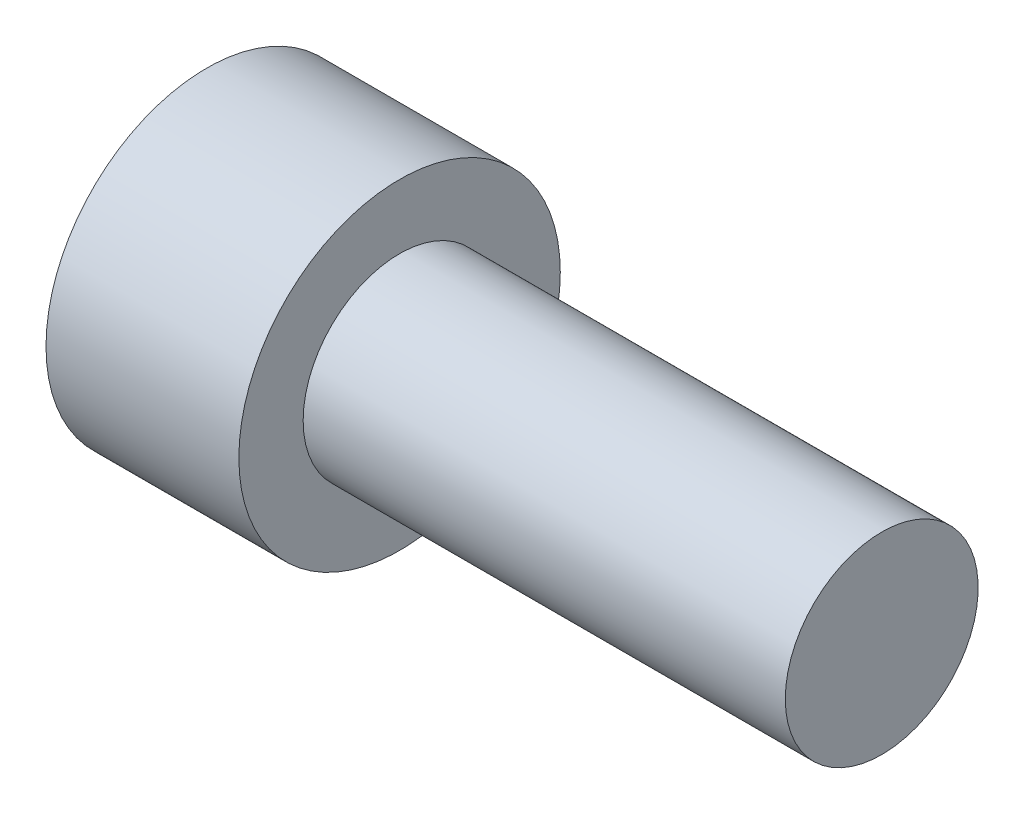
ISO-10303-21;
HEADER;
FILE_DESCRIPTION(('STEP AP214'),'2;1');
FILE_NAME('part.step','',(''),(''),'','','');
FILE_SCHEMA(('AUTOMOTIVE_DESIGN { 1 0 10303 214 1 1 1 1 }'));
ENDSEC;
DATA;
#1=APPLICATION_CONTEXT('core data for automotive mechanical design processes');
#2=APPLICATION_PROTOCOL_DEFINITION('international standard','automotive_design',2000,#1);
#3=PRODUCT_CONTEXT('',#1,'mechanical');
#4=PRODUCT('Part','Part','',(#3));
#5=PRODUCT_RELATED_PRODUCT_CATEGORY('part','',(#4));
#6=PRODUCT_DEFINITION_FORMATION('','',#4);
#7=PRODUCT_DEFINITION_CONTEXT('part definition',#1,'design');
#8=PRODUCT_DEFINITION('design','',#6,#7);
#9=PRODUCT_DEFINITION_SHAPE('','',#8);
#10=(LENGTH_UNIT() NAMED_UNIT(*) SI_UNIT(.MILLI.,.METRE.));
#11=(NAMED_UNIT(*) PLANE_ANGLE_UNIT() SI_UNIT($,.RADIAN.));
#12=(NAMED_UNIT(*) SI_UNIT($,.STERADIAN.) SOLID_ANGLE_UNIT());
#13=UNCERTAINTY_MEASURE_WITH_UNIT(LENGTH_MEASURE(1.E-05),#10,'distance_accuracy_value','');
#14=(GEOMETRIC_REPRESENTATION_CONTEXT(3) GLOBAL_UNCERTAINTY_ASSIGNED_CONTEXT((#13)) GLOBAL_UNIT_ASSIGNED_CONTEXT((#10,
#11,#12)) REPRESENTATION_CONTEXT('',''));
#15=CARTESIAN_POINT('',(0.,0.,0.));
#16=DIRECTION('',(0.,0.,1.));
#17=DIRECTION('',(1.,0.,0.));
#18=AXIS2_PLACEMENT_3D('',#15,#16,#17);
#19=CARTESIAN_POINT('',(0.,0.,0.));
#20=DIRECTION('',(1.,0.,0.));
#21=DIRECTION('',(0.,0.,-1.));
#22=AXIS2_PLACEMENT_3D('',#19,#20,#21);
#23=PLANE('',#22);
#24=CARTESIAN_POINT('',(0.,0.,0.));
#25=DIRECTION('',(-1.,0.,0.));
#26=DIRECTION('',(0.,0.,1.));
#27=AXIS2_PLACEMENT_3D('',#24,#25,#26);
#28=CIRCLE('',#27,5.);
#29=CARTESIAN_POINT('',(0.,0.,5.));
#30=VERTEX_POINT('',#29);
#31=EDGE_CURVE('E11',#30,#30,#28,.T.);
#32=ORIENTED_EDGE('',*,*,#31,.T.);
#33=EDGE_LOOP('',(#32));
#34=FACE_BOUND('',#33,.T.);
#35=DIRECTION('',(0.,0.5,0.866025403784438));
#36=VECTOR('',#35,1.);
#37=CARTESIAN_POINT('',(0.,-2.88675134594813,0.));
#38=LINE('',#37,#36);
#39=CARTESIAN_POINT('',(0.,-2.88675134594813,0.));
#40=VERTEX_POINT('',#39);
#41=CARTESIAN_POINT('',(0.,-1.44337567297406,2.5));
#42=VERTEX_POINT('',#41);
#43=EDGE_CURVE('E153',#40,#42,#38,.T.);
#44=ORIENTED_EDGE('',*,*,#43,.F.);
#45=DIRECTION('',(0.,-0.5,0.866025403784439));
#46=VECTOR('',#45,1.);
#47=CARTESIAN_POINT('',(0.,-1.44337567297407,-2.5));
#48=LINE('',#47,#46);
#49=CARTESIAN_POINT('',(0.,-1.44337567297407,-2.5));
#50=VERTEX_POINT('',#49);
#51=EDGE_CURVE('E53',#50,#40,#48,.T.);
#52=ORIENTED_EDGE('',*,*,#51,.F.);
#53=DIRECTION('',(0.,-1.,0.));
#54=VECTOR('',#53,1.);
#55=CARTESIAN_POINT('',(0.,1.44337567297406,-2.5));
#56=LINE('',#55,#54);
#57=CARTESIAN_POINT('',(0.,1.44337567297406,-2.5));
#58=VERTEX_POINT('',#57);
#59=EDGE_CURVE('E123',#58,#50,#56,.T.);
#60=ORIENTED_EDGE('',*,*,#59,.F.);
#61=DIRECTION('',(0.,-0.5,-0.866025403784438));
#62=VECTOR('',#61,1.);
#63=CARTESIAN_POINT('',(0.,2.88675134594813,0.));
#64=LINE('',#63,#62);
#65=CARTESIAN_POINT('',(0.,2.88675134594813,0.));
#66=VERTEX_POINT('',#65);
#67=EDGE_CURVE('E159',#66,#58,#64,.T.);
#68=ORIENTED_EDGE('',*,*,#67,.F.);
#69=DIRECTION('',(0.,0.5,-0.866025403784439));
#70=VECTOR('',#69,1.);
#71=CARTESIAN_POINT('',(0.,1.44337567297406,2.5));
#72=LINE('',#71,#70);
#73=CARTESIAN_POINT('',(0.,1.44337567297406,2.5));
#74=VERTEX_POINT('',#73);
#75=EDGE_CURVE('E157',#74,#66,#72,.T.);
#76=ORIENTED_EDGE('',*,*,#75,.F.);
#77=DIRECTION('',(0.,1.,0.));
#78=VECTOR('',#77,1.);
#79=CARTESIAN_POINT('',(0.,-1.44337567297406,2.5));
#80=LINE('',#79,#78);
#81=EDGE_CURVE('E155',#42,#74,#80,.T.);
#82=ORIENTED_EDGE('',*,*,#81,.F.);
#83=EDGE_LOOP('',(#44,#52,#60,#68,#76,#82));
#84=FACE_BOUND('',#83,.T.);
#85=ADVANCED_FACE('F39',(#34,#84),#23,.F.);
#86=CARTESIAN_POINT('',(0.,0.,0.));
#87=DIRECTION('',(-1.,0.,0.));
#88=DIRECTION('',(0.,0.,1.));
#89=AXIS2_PLACEMENT_3D('',#86,#87,#88);
#90=CYLINDRICAL_SURFACE('',#89,5.);
#91=ORIENTED_EDGE('',*,*,#31,.F.);
#92=EDGE_LOOP('',(#91));
#93=FACE_BOUND('',#92,.T.);
#94=CARTESIAN_POINT('',(6.,0.,0.));
#95=DIRECTION('',(-1.,0.,0.));
#96=DIRECTION('',(0.,0.,1.));
#97=AXIS2_PLACEMENT_3D('',#94,#95,#96);
#98=CIRCLE('',#97,5.);
#99=CARTESIAN_POINT('',(6.,0.,5.));
#100=VERTEX_POINT('',#99);
#101=EDGE_CURVE('E46',#100,#100,#98,.T.);
#102=ORIENTED_EDGE('',*,*,#101,.T.);
#103=EDGE_LOOP('',(#102));
#104=FACE_BOUND('',#103,.T.);
#105=ADVANCED_FACE('F187',(#93,#104),#90,.T.);
#106=CARTESIAN_POINT('',(6.,3.,0.));
#107=DIRECTION('',(-1.,0.,0.));
#108=DIRECTION('',(0.,0.,1.));
#109=AXIS2_PLACEMENT_3D('',#106,#107,#108);
#110=PLANE('',#109);
#111=ORIENTED_EDGE('',*,*,#101,.F.);
#112=EDGE_LOOP('',(#111));
#113=FACE_BOUND('',#112,.T.);
#114=CARTESIAN_POINT('',(6.,0.,0.));
#115=DIRECTION('',(-1.,0.,0.));
#116=DIRECTION('',(0.,0.,1.));
#117=AXIS2_PLACEMENT_3D('',#114,#115,#116);
#118=CIRCLE('',#117,3.);
#119=CARTESIAN_POINT('',(6.,0.,3.));
#120=VERTEX_POINT('',#119);
#121=EDGE_CURVE('E182',#120,#120,#118,.T.);
#122=ORIENTED_EDGE('',*,*,#121,.T.);
#123=EDGE_LOOP('',(#122));
#124=FACE_BOUND('',#123,.T.);
#125=ADVANCED_FACE('F189',(#113,#124),#110,.F.);
#126=CARTESIAN_POINT('',(0.,0.,0.));
#127=DIRECTION('',(-1.,0.,0.));
#128=DIRECTION('',(0.,0.,1.));
#129=AXIS2_PLACEMENT_3D('',#126,#127,#128);
#130=CYLINDRICAL_SURFACE('',#129,3.);
#131=ORIENTED_EDGE('',*,*,#121,.F.);
#132=EDGE_LOOP('',(#131));
#133=FACE_BOUND('',#132,.T.);
#134=CARTESIAN_POINT('',(21.,0.,0.));
#135=DIRECTION('',(-1.,0.,0.));
#136=DIRECTION('',(0.,0.,1.));
#137=AXIS2_PLACEMENT_3D('',#134,#135,#136);
#138=CIRCLE('',#137,3.);
#139=CARTESIAN_POINT('',(21.,0.,3.));
#140=VERTEX_POINT('',#139);
#141=EDGE_CURVE('E178',#140,#140,#138,.T.);
#142=ORIENTED_EDGE('',*,*,#141,.T.);
#143=EDGE_LOOP('',(#142));
#144=FACE_BOUND('',#143,.T.);
#145=ADVANCED_FACE('F192',(#133,#144),#130,.T.);
#146=CARTESIAN_POINT('',(21.,3.,0.));
#147=DIRECTION('',(-1.,0.,0.));
#148=DIRECTION('',(0.,0.,1.));
#149=AXIS2_PLACEMENT_3D('',#146,#147,#148);
#150=PLANE('',#149);
#151=ORIENTED_EDGE('',*,*,#141,.F.);
#152=EDGE_LOOP('',(#151));
#153=FACE_BOUND('',#152,.T.);
#154=ADVANCED_FACE('F198',(#153),#150,.F.);
#155=CARTESIAN_POINT('',(3.,-1.44337567297407,-2.5));
#156=DIRECTION('',(0.,-0.866025403784439,-0.5));
#157=DIRECTION('',(0.,0.5,-0.866025403784439));
#158=AXIS2_PLACEMENT_3D('',#155,#156,#157);
#159=PLANE('',#158);
#160=DIRECTION('',(0.,-0.5,0.866025403784439));
#161=VECTOR('',#160,1.);
#162=CARTESIAN_POINT('',(3.,-1.44337567297407,-2.5));
#163=LINE('',#162,#161);
#164=CARTESIAN_POINT('',(3.,-1.44337567297407,-2.5));
#165=VERTEX_POINT('',#164);
#166=CARTESIAN_POINT('',(3.,-2.1650635094611,-1.25));
#167=VERTEX_POINT('',#166);
#168=EDGE_CURVE('E122',#165,#167,#163,.T.);
#169=ORIENTED_EDGE('',*,*,#168,.F.);
#170=DIRECTION('',(-1.,0.,0.));
#171=VECTOR('',#170,1.);
#172=CARTESIAN_POINT('',(3.,-1.44337567297407,-2.5));
#173=LINE('',#172,#171);
#174=EDGE_CURVE('E162',#165,#50,#173,.T.);
#175=ORIENTED_EDGE('',*,*,#174,.T.);
#176=ORIENTED_EDGE('',*,*,#51,.T.);
#177=DIRECTION('',(-1.,0.,0.));
#178=VECTOR('',#177,1.);
#179=CARTESIAN_POINT('',(3.,-2.88675134594813,0.));
#180=LINE('',#179,#178);
#181=CARTESIAN_POINT('',(3.,-2.88675134594813,0.));
#182=VERTEX_POINT('',#181);
#183=EDGE_CURVE('E125',#182,#40,#180,.T.);
#184=ORIENTED_EDGE('',*,*,#183,.F.);
#185=EDGE_CURVE('E114',#167,#182,#163,.T.);
#186=ORIENTED_EDGE('',*,*,#185,.F.);
#187=EDGE_LOOP('',(#169,#175,#176,#184,#186));
#188=FACE_BOUND('',#187,.T.);
#189=ADVANCED_FACE('F126',(#188),#159,.F.);
#190=CARTESIAN_POINT('',(3.,1.44337567297406,-2.5));
#191=DIRECTION('',(0.,0.,-1.));
#192=DIRECTION('',(0.,1.,0.));
#193=AXIS2_PLACEMENT_3D('',#190,#191,#192);
#194=PLANE('',#193);
#195=DIRECTION('',(0.,-1.,0.));
#196=VECTOR('',#195,1.);
#197=CARTESIAN_POINT('',(3.,1.44337567297406,-2.5));
#198=LINE('',#197,#196);
#199=CARTESIAN_POINT('',(3.,1.44337567297406,-2.5));
#200=VERTEX_POINT('',#199);
#201=CARTESIAN_POINT('',(3.,0.,-2.5));
#202=VERTEX_POINT('',#201);
#203=EDGE_CURVE('E131',#200,#202,#198,.T.);
#204=ORIENTED_EDGE('',*,*,#203,.F.);
#205=DIRECTION('',(-1.,0.,0.));
#206=VECTOR('',#205,1.);
#207=CARTESIAN_POINT('',(3.,1.44337567297406,-2.5));
#208=LINE('',#207,#206);
#209=EDGE_CURVE('E164',#200,#58,#208,.T.);
#210=ORIENTED_EDGE('',*,*,#209,.T.);
#211=ORIENTED_EDGE('',*,*,#59,.T.);
#212=ORIENTED_EDGE('',*,*,#174,.F.);
#213=EDGE_CURVE('E149',#202,#165,#198,.T.);
#214=ORIENTED_EDGE('',*,*,#213,.F.);
#215=EDGE_LOOP('',(#204,#210,#211,#212,#214));
#216=FACE_BOUND('',#215,.T.);
#217=ADVANCED_FACE('F207',(#216),#194,.F.);
#218=CARTESIAN_POINT('',(3.,2.88675134594813,0.));
#219=DIRECTION('',(0.,0.866025403784439,-0.5));
#220=DIRECTION('',(0.,0.5,0.866025403784439));
#221=AXIS2_PLACEMENT_3D('',#218,#219,#220);
#222=PLANE('',#221);
#223=DIRECTION('',(0.,-0.5,-0.866025403784438));
#224=VECTOR('',#223,1.);
#225=CARTESIAN_POINT('',(3.,2.88675134594813,0.));
#226=LINE('',#225,#224);
#227=CARTESIAN_POINT('',(3.,2.88675134594813,0.));
#228=VERTEX_POINT('',#227);
#229=CARTESIAN_POINT('',(3.,2.16506350946109,-1.25));
#230=VERTEX_POINT('',#229);
#231=EDGE_CURVE('E146',#228,#230,#226,.T.);
#232=ORIENTED_EDGE('',*,*,#231,.F.);
#233=DIRECTION('',(-1.,0.,0.));
#234=VECTOR('',#233,1.);
#235=CARTESIAN_POINT('',(3.,2.88675134594813,0.));
#236=LINE('',#235,#234);
#237=EDGE_CURVE('E167',#228,#66,#236,.T.);
#238=ORIENTED_EDGE('',*,*,#237,.T.);
#239=ORIENTED_EDGE('',*,*,#67,.T.);
#240=ORIENTED_EDGE('',*,*,#209,.F.);
#241=EDGE_CURVE('E145',#230,#200,#226,.T.);
#242=ORIENTED_EDGE('',*,*,#241,.F.);
#243=EDGE_LOOP('',(#232,#238,#239,#240,#242));
#244=FACE_BOUND('',#243,.T.);
#245=ADVANCED_FACE('F260',(#244),#222,.F.);
#246=CARTESIAN_POINT('',(3.,1.44337567297406,2.5));
#247=DIRECTION('',(0.,0.866025403784439,0.5));
#248=DIRECTION('',(0.,-0.5,0.866025403784439));
#249=AXIS2_PLACEMENT_3D('',#246,#247,#248);
#250=PLANE('',#249);
#251=DIRECTION('',(0.,0.5,-0.866025403784439));
#252=VECTOR('',#251,1.);
#253=CARTESIAN_POINT('',(3.,1.44337567297406,2.5));
#254=LINE('',#253,#252);
#255=CARTESIAN_POINT('',(3.,1.44337567297406,2.5));
#256=VERTEX_POINT('',#255);
#257=CARTESIAN_POINT('',(3.,2.1650635094611,1.25));
#258=VERTEX_POINT('',#257);
#259=EDGE_CURVE('E142',#256,#258,#254,.T.);
#260=ORIENTED_EDGE('',*,*,#259,.F.);
#261=DIRECTION('',(-1.,0.,0.));
#262=VECTOR('',#261,1.);
#263=CARTESIAN_POINT('',(3.,1.44337567297406,2.5));
#264=LINE('',#263,#262);
#265=EDGE_CURVE('E170',#256,#74,#264,.T.);
#266=ORIENTED_EDGE('',*,*,#265,.T.);
#267=ORIENTED_EDGE('',*,*,#75,.T.);
#268=ORIENTED_EDGE('',*,*,#237,.F.);
#269=EDGE_CURVE('E141',#258,#228,#254,.T.);
#270=ORIENTED_EDGE('',*,*,#269,.F.);
#271=EDGE_LOOP('',(#260,#266,#267,#268,#270));
#272=FACE_BOUND('',#271,.T.);
#273=ADVANCED_FACE('F255',(#272),#250,.F.);
#274=CARTESIAN_POINT('',(3.,-1.44337567297406,2.5));
#275=DIRECTION('',(0.,0.,1.));
#276=DIRECTION('',(0.,-1.,0.));
#277=AXIS2_PLACEMENT_3D('',#274,#275,#276);
#278=PLANE('',#277);
#279=DIRECTION('',(0.,1.,0.));
#280=VECTOR('',#279,1.);
#281=CARTESIAN_POINT('',(3.,-1.44337567297406,2.5));
#282=LINE('',#281,#280);
#283=CARTESIAN_POINT('',(3.,-1.44337567297406,2.5));
#284=VERTEX_POINT('',#283);
#285=CARTESIAN_POINT('',(3.,0.,2.5));
#286=VERTEX_POINT('',#285);
#287=EDGE_CURVE('E61',#284,#286,#282,.T.);
#288=ORIENTED_EDGE('',*,*,#287,.F.);
#289=DIRECTION('',(-1.,0.,0.));
#290=VECTOR('',#289,1.);
#291=CARTESIAN_POINT('',(3.,-1.44337567297406,2.5));
#292=LINE('',#291,#290);
#293=EDGE_CURVE('E130',#284,#42,#292,.T.);
#294=ORIENTED_EDGE('',*,*,#293,.T.);
#295=ORIENTED_EDGE('',*,*,#81,.T.);
#296=ORIENTED_EDGE('',*,*,#265,.F.);
#297=EDGE_CURVE('E137',#286,#256,#282,.T.);
#298=ORIENTED_EDGE('',*,*,#297,.F.);
#299=EDGE_LOOP('',(#288,#294,#295,#296,#298));
#300=FACE_BOUND('',#299,.T.);
#301=ADVANCED_FACE('F221',(#300),#278,.F.);
#302=CARTESIAN_POINT('',(3.,-2.88675134594813,0.));
#303=DIRECTION('',(0.,-0.866025403784439,0.5));
#304=DIRECTION('',(0.,-0.5,-0.866025403784439));
#305=AXIS2_PLACEMENT_3D('',#302,#303,#304);
#306=PLANE('',#305);
#307=DIRECTION('',(0.,0.5,0.866025403784438));
#308=VECTOR('',#307,1.);
#309=CARTESIAN_POINT('',(3.,-2.88675134594813,0.));
#310=LINE('',#309,#308);
#311=CARTESIAN_POINT('',(3.,-2.1650635094611,1.25));
#312=VERTEX_POINT('',#311);
#313=EDGE_CURVE('E117',#182,#312,#310,.T.);
#314=ORIENTED_EDGE('',*,*,#313,.F.);
#315=ORIENTED_EDGE('',*,*,#183,.T.);
#316=ORIENTED_EDGE('',*,*,#43,.T.);
#317=ORIENTED_EDGE('',*,*,#293,.F.);
#318=EDGE_CURVE('E136',#312,#284,#310,.T.);
#319=ORIENTED_EDGE('',*,*,#318,.F.);
#320=EDGE_LOOP('',(#314,#315,#316,#317,#319));
#321=FACE_BOUND('',#320,.T.);
#322=ADVANCED_FACE('F134',(#321),#306,.F.);
#323=CARTESIAN_POINT('',(3.,0.,0.));
#324=DIRECTION('',(-1.,0.,0.));
#325=DIRECTION('',(0.,0.,1.));
#326=AXIS2_PLACEMENT_3D('',#323,#324,#325);
#327=PLANE('',#326);
#328=ORIENTED_EDGE('',*,*,#297,.T.);
#329=ORIENTED_EDGE('',*,*,#259,.T.);
#330=CARTESIAN_POINT('',(3.,0.,0.));
#331=DIRECTION('',(-1.,0.,0.));
#332=DIRECTION('',(0.,-1.,0.));
#333=AXIS2_PLACEMENT_3D('',#330,#331,#332);
#334=CIRCLE('',#333,2.5);
#335=EDGE_CURVE('E179',#286,#258,#334,.T.);
#336=ORIENTED_EDGE('',*,*,#335,.F.);
#337=EDGE_LOOP('',(#328,#329,#336));
#338=FACE_BOUND('',#337,.T.);
#339=ADVANCED_FACE('F227',(#338),#327,.T.);
#340=ORIENTED_EDGE('',*,*,#269,.T.);
#341=ORIENTED_EDGE('',*,*,#231,.T.);
#342=EDGE_CURVE('E230',#258,#230,#334,.T.);
#343=ORIENTED_EDGE('',*,*,#342,.F.);
#344=EDGE_LOOP('',(#340,#341,#343));
#345=FACE_BOUND('',#344,.T.);
#346=ADVANCED_FACE('F244',(#345),#327,.T.);
#347=ORIENTED_EDGE('',*,*,#241,.T.);
#348=ORIENTED_EDGE('',*,*,#203,.T.);
#349=EDGE_CURVE('E274',#230,#202,#334,.T.);
#350=ORIENTED_EDGE('',*,*,#349,.F.);
#351=EDGE_LOOP('',(#347,#348,#350));
#352=FACE_BOUND('',#351,.T.);
#353=ADVANCED_FACE('F249',(#352),#327,.T.);
#354=ORIENTED_EDGE('',*,*,#213,.T.);
#355=ORIENTED_EDGE('',*,*,#168,.T.);
#356=EDGE_CURVE('E276',#202,#167,#334,.T.);
#357=ORIENTED_EDGE('',*,*,#356,.F.);
#358=EDGE_LOOP('',(#354,#355,#357));
#359=FACE_BOUND('',#358,.T.);
#360=ADVANCED_FACE('F241',(#359),#327,.T.);
#361=ORIENTED_EDGE('',*,*,#185,.T.);
#362=ORIENTED_EDGE('',*,*,#313,.T.);
#363=EDGE_CURVE('E119',#167,#312,#334,.T.);
#364=ORIENTED_EDGE('',*,*,#363,.F.);
#365=EDGE_LOOP('',(#361,#362,#364));
#366=FACE_BOUND('',#365,.T.);
#367=ADVANCED_FACE('F115',(#366),#327,.T.);
#368=ORIENTED_EDGE('',*,*,#318,.T.);
#369=ORIENTED_EDGE('',*,*,#287,.T.);
#370=EDGE_CURVE('E175',#312,#286,#334,.T.);
#371=ORIENTED_EDGE('',*,*,#370,.F.);
#372=EDGE_LOOP('',(#368,#369,#371));
#373=FACE_BOUND('',#372,.T.);
#374=ADVANCED_FACE('F234',(#373),#327,.T.);
#375=CARTESIAN_POINT('',(4.44337567297406,0.,0.));
#376=DIRECTION('',(-1.,0.,0.));
#377=DIRECTION('',(0.,-1.,0.));
#378=AXIS2_PLACEMENT_3D('',#375,#376,#377);
#379=CONICAL_SURFACE('',#378,0.,1.0471975511966);
#380=ORIENTED_EDGE('',*,*,#370,.T.);
#381=ORIENTED_EDGE('',*,*,#335,.T.);
#382=ORIENTED_EDGE('',*,*,#342,.T.);
#383=ORIENTED_EDGE('',*,*,#349,.T.);
#384=ORIENTED_EDGE('',*,*,#356,.T.);
#385=ORIENTED_EDGE('',*,*,#363,.T.);
#386=EDGE_LOOP('',(#380,#381,#382,#383,#384,#385));
#387=FACE_BOUND('',#386,.T.);
#388=CARTESIAN_POINT('',(4.44337567297406,0.,0.));
#389=VERTEX_POINT('',#388);
#390=VERTEX_LOOP('',#389);
#391=FACE_BOUND('',#390,.T.);
#392=ADVANCED_FACE('F231',(#387,#391),#379,.F.);
#393=CLOSED_SHELL('',(#85,#105,#125,#145,#154,#189,#217,#245,#273,#301,#322,#339,#346,#353,#360,
#367,#374,#392));
#394=MANIFOLD_SOLID_BREP('B2',#393);
#395=ADVANCED_BREP_SHAPE_REPRESENTATION('',(#18,#394),#14);
#396=SHAPE_DEFINITION_REPRESENTATION(#9,#395);
ENDSEC;
END-ISO-10303-21;
